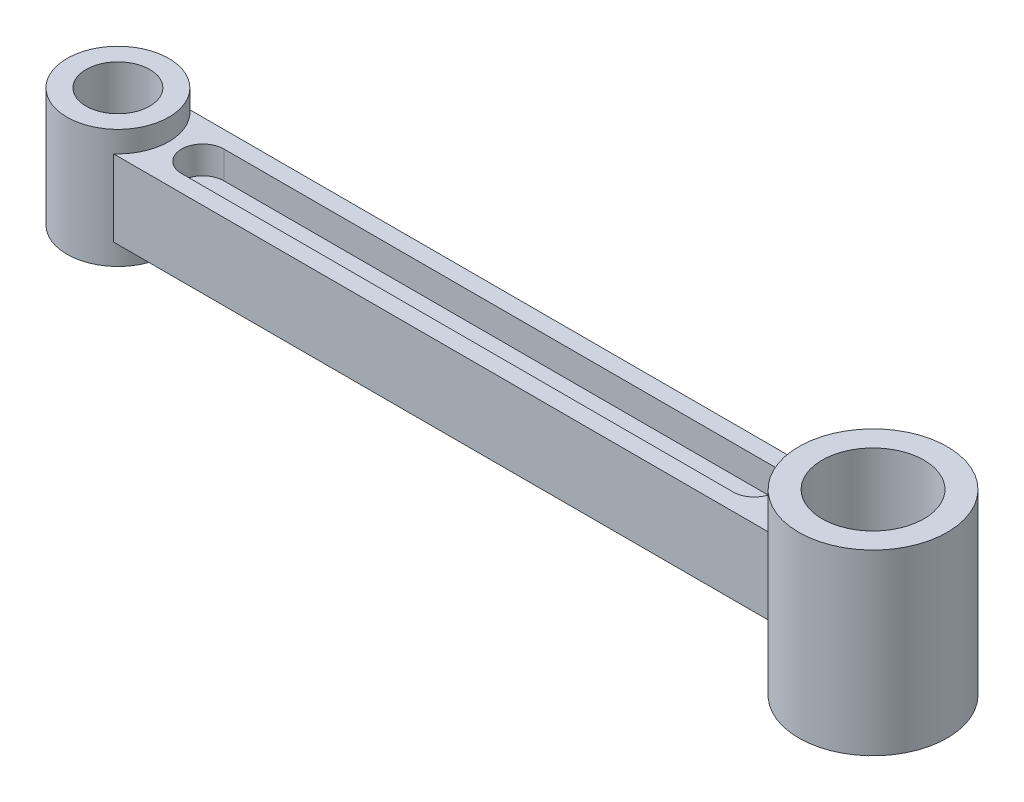
ISO-10303-21;
HEADER;
FILE_DESCRIPTION(('STEP AP214'),'2;1');
FILE_NAME('part.step','',(''),(''),'','','');
FILE_SCHEMA(('AUTOMOTIVE_DESIGN { 1 0 10303 214 1 1 1 1 }'));
ENDSEC;
DATA;
#1=APPLICATION_CONTEXT('core data for automotive mechanical design processes');
#2=APPLICATION_PROTOCOL_DEFINITION('international standard','automotive_design',2000,#1);
#3=PRODUCT_CONTEXT('',#1,'mechanical');
#4=PRODUCT('Part','Part','',(#3));
#5=PRODUCT_RELATED_PRODUCT_CATEGORY('part','',(#4));
#6=PRODUCT_DEFINITION_FORMATION('','',#4);
#7=PRODUCT_DEFINITION_CONTEXT('part definition',#1,'design');
#8=PRODUCT_DEFINITION('design','',#6,#7);
#9=PRODUCT_DEFINITION_SHAPE('','',#8);
#10=(LENGTH_UNIT() NAMED_UNIT(*) SI_UNIT(.MILLI.,.METRE.));
#11=(NAMED_UNIT(*) PLANE_ANGLE_UNIT() SI_UNIT($,.RADIAN.));
#12=(NAMED_UNIT(*) SI_UNIT($,.STERADIAN.) SOLID_ANGLE_UNIT());
#13=UNCERTAINTY_MEASURE_WITH_UNIT(LENGTH_MEASURE(1.E-05),#10,'distance_accuracy_value','');
#14=(GEOMETRIC_REPRESENTATION_CONTEXT(3) GLOBAL_UNCERTAINTY_ASSIGNED_CONTEXT((#13)) GLOBAL_UNIT_ASSIGNED_CONTEXT((#10,
#11,#12)) REPRESENTATION_CONTEXT('',''));
#15=CARTESIAN_POINT('',(0.,0.,0.));
#16=DIRECTION('',(0.,0.,1.));
#17=DIRECTION('',(1.,0.,0.));
#18=AXIS2_PLACEMENT_3D('',#15,#16,#17);
#19=CARTESIAN_POINT('',(0.,9.,4.99999999999999));
#20=DIRECTION('',(0.,0.,-1.));
#21=DIRECTION('',(-1.,0.,0.));
#22=AXIS2_PLACEMENT_3D('',#19,#20,#21);
#23=PLANE('',#22);
#24=DIRECTION('',(0.,-1.,0.));
#25=VECTOR('',#24,1.);
#26=CARTESIAN_POINT('',(20.,9.,4.99999999999999));
#27=LINE('',#26,#25);
#28=CARTESIAN_POINT('',(20.,-2.5,4.99999999999999));
#29=VERTEX_POINT('',#28);
#30=CARTESIAN_POINT('',(20.,-9.,4.99999999999999));
#31=VERTEX_POINT('',#30);
#32=EDGE_CURVE('E274',#29,#31,#27,.T.);
#33=ORIENTED_EDGE('',*,*,#32,.F.);
#34=DIRECTION('',(1.,0.,0.));
#35=VECTOR('',#34,1.);
#36=CARTESIAN_POINT('',(0.,-2.5,4.99999999999999));
#37=LINE('',#36,#35);
#38=CARTESIAN_POINT('',(150.,-2.5,5.00000000000002));
#39=VERTEX_POINT('',#38);
#40=EDGE_CURVE('E166',#29,#39,#37,.T.);
#41=ORIENTED_EDGE('',*,*,#40,.T.);
#42=DIRECTION('',(0.,-1.,0.));
#43=VECTOR('',#42,1.);
#44=CARTESIAN_POINT('',(150.,9.,5.00000000000002));
#45=LINE('',#44,#43);
#46=CARTESIAN_POINT('',(150.,-9.,5.00000000000002));
#47=VERTEX_POINT('',#46);
#48=EDGE_CURVE('E222',#39,#47,#45,.T.);
#49=ORIENTED_EDGE('',*,*,#48,.T.);
#50=DIRECTION('',(1.,0.,0.));
#51=VECTOR('',#50,1.);
#52=CARTESIAN_POINT('',(0.,-9.,4.99999999999999));
#53=LINE('',#52,#51);
#54=EDGE_CURVE('E187',#31,#47,#53,.T.);
#55=ORIENTED_EDGE('',*,*,#54,.F.);
#56=EDGE_LOOP('',(#33,#41,#49,#55));
#57=FACE_BOUND('',#56,.T.);
#58=ADVANCED_FACE('F40',(#57),#23,.T.);
#59=CARTESIAN_POINT('',(20.,9.,0.));
#60=DIRECTION('',(0.,-1.,0.));
#61=DIRECTION('',(0.,0.,-1.));
#62=AXIS2_PLACEMENT_3D('',#59,#60,#61);
#63=CYLINDRICAL_SURFACE('',#62,4.99999999999998);
#64=DIRECTION('',(0.,-1.,0.));
#65=VECTOR('',#64,1.);
#66=CARTESIAN_POINT('',(20.,9.,-4.99999999999999));
#67=LINE('',#66,#65);
#68=CARTESIAN_POINT('',(20.,-2.5,-4.99999999999999));
#69=VERTEX_POINT('',#68);
#70=CARTESIAN_POINT('',(20.,-9.,-4.99999999999999));
#71=VERTEX_POINT('',#70);
#72=EDGE_CURVE('E143',#69,#71,#67,.T.);
#73=ORIENTED_EDGE('',*,*,#72,.F.);
#74=CARTESIAN_POINT('',(20.,-2.5,0.));
#75=DIRECTION('',(0.,1.,0.));
#76=DIRECTION('',(0.,0.,1.));
#77=AXIS2_PLACEMENT_3D('',#74,#75,#76);
#78=CIRCLE('',#77,4.99999999999998);
#79=EDGE_CURVE('E162',#69,#29,#78,.T.);
#80=ORIENTED_EDGE('',*,*,#79,.T.);
#81=ORIENTED_EDGE('',*,*,#32,.T.);
#82=CARTESIAN_POINT('',(20.,-9.,0.));
#83=DIRECTION('',(0.,1.,0.));
#84=DIRECTION('',(0.,0.,1.));
#85=AXIS2_PLACEMENT_3D('',#82,#83,#84);
#86=CIRCLE('',#85,4.99999999999998);
#87=EDGE_CURVE('E226',#71,#31,#86,.T.);
#88=ORIENTED_EDGE('',*,*,#87,.F.);
#89=EDGE_LOOP('',(#73,#80,#81,#88));
#90=FACE_BOUND('',#89,.T.);
#91=ADVANCED_FACE('F305',(#90),#63,.F.);
#92=CARTESIAN_POINT('',(0.,9.,-4.99999999999999));
#93=DIRECTION('',(0.,0.,1.));
#94=DIRECTION('',(1.,0.,0.));
#95=AXIS2_PLACEMENT_3D('',#92,#93,#94);
#96=PLANE('',#95);
#97=DIRECTION('',(0.,-1.,0.));
#98=VECTOR('',#97,1.);
#99=CARTESIAN_POINT('',(150.,9.,-5.00000000000004));
#100=LINE('',#99,#98);
#101=CARTESIAN_POINT('',(150.,-2.5,-5.00000000000004));
#102=VERTEX_POINT('',#101);
#103=CARTESIAN_POINT('',(150.,-9.,-5.00000000000004));
#104=VERTEX_POINT('',#103);
#105=EDGE_CURVE('E144',#102,#104,#100,.T.);
#106=ORIENTED_EDGE('',*,*,#105,.F.);
#107=DIRECTION('',(-1.,0.,0.));
#108=VECTOR('',#107,1.);
#109=CARTESIAN_POINT('',(0.,-2.5,-4.99999999999999));
#110=LINE('',#109,#108);
#111=EDGE_CURVE('E174',#102,#69,#110,.T.);
#112=ORIENTED_EDGE('',*,*,#111,.T.);
#113=ORIENTED_EDGE('',*,*,#72,.T.);
#114=DIRECTION('',(-1.,0.,0.));
#115=VECTOR('',#114,1.);
#116=CARTESIAN_POINT('',(0.,-9.,-4.99999999999999));
#117=LINE('',#116,#115);
#118=EDGE_CURVE('E230',#104,#71,#117,.T.);
#119=ORIENTED_EDGE('',*,*,#118,.F.);
#120=EDGE_LOOP('',(#106,#112,#113,#119));
#121=FACE_BOUND('',#120,.T.);
#122=ADVANCED_FACE('F312',(#121),#96,.T.);
#123=CARTESIAN_POINT('',(150.,9.,0.));
#124=DIRECTION('',(0.,-1.,0.));
#125=DIRECTION('',(0.,0.,-1.));
#126=AXIS2_PLACEMENT_3D('',#123,#124,#125);
#127=CYLINDRICAL_SURFACE('',#126,5.);
#128=ORIENTED_EDGE('',*,*,#48,.F.);
#129=CARTESIAN_POINT('',(150.,-2.5,0.));
#130=DIRECTION('',(0.,1.,0.));
#131=DIRECTION('',(0.,0.,1.));
#132=AXIS2_PLACEMENT_3D('',#129,#130,#131);
#133=CIRCLE('',#132,5.);
#134=EDGE_CURVE('E170',#39,#102,#133,.T.);
#135=ORIENTED_EDGE('',*,*,#134,.T.);
#136=ORIENTED_EDGE('',*,*,#105,.T.);
#137=CARTESIAN_POINT('',(150.,-9.,0.));
#138=DIRECTION('',(0.,1.,0.));
#139=DIRECTION('',(0.,0.,1.));
#140=AXIS2_PLACEMENT_3D('',#137,#138,#139);
#141=CIRCLE('',#140,5.);
#142=EDGE_CURVE('E234',#47,#104,#141,.T.);
#143=ORIENTED_EDGE('',*,*,#142,.F.);
#144=EDGE_LOOP('',(#128,#135,#136,#143));
#145=FACE_BOUND('',#144,.T.);
#146=ADVANCED_FACE('F301',(#145),#127,.F.);
#147=CARTESIAN_POINT('',(0.,14.,0.));
#148=DIRECTION('',(0.,-1.,0.));
#149=DIRECTION('',(0.,0.,-1.));
#150=AXIS2_PLACEMENT_3D('',#147,#148,#149);
#151=CYLINDRICAL_SURFACE('',#150,12.);
#152=DIRECTION('',(0.,-1.,0.));
#153=VECTOR('',#152,1.);
#154=CARTESIAN_POINT('',(7.93725393319381,9.,9.00000000000001));
#155=LINE('',#154,#153);
#156=CARTESIAN_POINT('',(7.93725393319381,9.,9.00000000000001));
#157=VERTEX_POINT('',#156);
#158=CARTESIAN_POINT('',(7.93725393319381,-9.,9.00000000000001));
#159=VERTEX_POINT('',#158);
#160=EDGE_CURVE('E264',#157,#159,#155,.T.);
#161=ORIENTED_EDGE('',*,*,#160,.F.);
#162=CARTESIAN_POINT('',(0.,9.,0.));
#163=DIRECTION('',(0.,1.,0.));
#164=DIRECTION('',(0.,0.,1.));
#165=AXIS2_PLACEMENT_3D('',#162,#163,#164);
#166=CIRCLE('',#165,12.);
#167=CARTESIAN_POINT('',(7.93725393319381,9.,-9.00000000000002));
#168=VERTEX_POINT('',#167);
#169=EDGE_CURVE('E208',#157,#168,#166,.T.);
#170=ORIENTED_EDGE('',*,*,#169,.T.);
#171=DIRECTION('',(0.,-1.,0.));
#172=VECTOR('',#171,1.);
#173=CARTESIAN_POINT('',(7.93725393319381,9.,-9.00000000000002));
#174=LINE('',#173,#172);
#175=CARTESIAN_POINT('',(7.93725393319381,-9.,-9.00000000000002));
#176=VERTEX_POINT('',#175);
#177=EDGE_CURVE('E253',#168,#176,#174,.T.);
#178=ORIENTED_EDGE('',*,*,#177,.T.);
#179=CARTESIAN_POINT('',(0.,-9.,0.));
#180=DIRECTION('',(0.,1.,0.));
#181=DIRECTION('',(0.,0.,1.));
#182=AXIS2_PLACEMENT_3D('',#179,#180,#181);
#183=CIRCLE('',#182,12.);
#184=EDGE_CURVE('E238',#159,#176,#183,.T.);
#185=ORIENTED_EDGE('',*,*,#184,.F.);
#186=EDGE_LOOP('',(#161,#170,#178,#185));
#187=FACE_BOUND('',#186,.T.);
#188=CARTESIAN_POINT('',(0.,14.,0.));
#189=DIRECTION('',(0.,1.,0.));
#190=DIRECTION('',(0.,0.,1.));
#191=AXIS2_PLACEMENT_3D('',#188,#189,#190);
#192=CIRCLE('',#191,12.);
#193=CARTESIAN_POINT('',(0.,14.,12.));
#194=VERTEX_POINT('',#193);
#195=EDGE_CURVE('E50',#194,#194,#192,.T.);
#196=ORIENTED_EDGE('',*,*,#195,.F.);
#197=EDGE_LOOP('',(#196));
#198=FACE_BOUND('',#197,.T.);
#199=CARTESIAN_POINT('',(0.,-14.,0.));
#200=DIRECTION('',(0.,1.,0.));
#201=DIRECTION('',(0.,0.,1.));
#202=AXIS2_PLACEMENT_3D('',#199,#200,#201);
#203=CIRCLE('',#202,12.);
#204=CARTESIAN_POINT('',(0.,-14.,12.));
#205=VERTEX_POINT('',#204);
#206=EDGE_CURVE('E268',#205,#205,#203,.T.);
#207=ORIENTED_EDGE('',*,*,#206,.T.);
#208=EDGE_LOOP('',(#207));
#209=FACE_BOUND('',#208,.T.);
#210=ADVANCED_FACE('F42',(#187,#198,#209),#151,.T.);
#211=CARTESIAN_POINT('',(0.,14.,0.));
#212=DIRECTION('',(0.,-1.,0.));
#213=DIRECTION('',(0.,0.,-1.));
#214=AXIS2_PLACEMENT_3D('',#211,#212,#213);
#215=CYLINDRICAL_SURFACE('',#214,7.5);
#216=CARTESIAN_POINT('',(0.,14.,0.));
#217=DIRECTION('',(0.,1.,0.));
#218=DIRECTION('',(0.,0.,1.));
#219=AXIS2_PLACEMENT_3D('',#216,#217,#218);
#220=CIRCLE('',#219,7.5);
#221=CARTESIAN_POINT('',(0.,14.,7.50000000000001));
#222=VERTEX_POINT('',#221);
#223=EDGE_CURVE('E11',#222,#222,#220,.T.);
#224=ORIENTED_EDGE('',*,*,#223,.T.);
#225=EDGE_LOOP('',(#224));
#226=FACE_BOUND('',#225,.T.);
#227=CARTESIAN_POINT('',(0.,-14.,0.));
#228=DIRECTION('',(0.,1.,0.));
#229=DIRECTION('',(0.,0.,1.));
#230=AXIS2_PLACEMENT_3D('',#227,#228,#229);
#231=CIRCLE('',#230,7.5);
#232=CARTESIAN_POINT('',(0.,-14.,7.50000000000001));
#233=VERTEX_POINT('',#232);
#234=EDGE_CURVE('E44',#233,#233,#231,.T.);
#235=ORIENTED_EDGE('',*,*,#234,.F.);
#236=EDGE_LOOP('',(#235));
#237=FACE_BOUND('',#236,.T.);
#238=ADVANCED_FACE('F291',(#226,#237),#215,.F.);
#239=CARTESIAN_POINT('',(0.,14.,0.));
#240=DIRECTION('',(0.,1.,0.));
#241=DIRECTION('',(0.,0.,1.));
#242=AXIS2_PLACEMENT_3D('',#239,#240,#241);
#243=PLANE('',#242);
#244=ORIENTED_EDGE('',*,*,#195,.T.);
#245=EDGE_LOOP('',(#244));
#246=FACE_BOUND('',#245,.T.);
#247=ORIENTED_EDGE('',*,*,#223,.F.);
#248=EDGE_LOOP('',(#247));
#249=FACE_BOUND('',#248,.T.);
#250=ADVANCED_FACE('F293',(#246,#249),#243,.T.);
#251=CARTESIAN_POINT('',(0.,-14.,0.));
#252=DIRECTION('',(0.,1.,0.));
#253=DIRECTION('',(0.,0.,1.));
#254=AXIS2_PLACEMENT_3D('',#251,#252,#253);
#255=PLANE('',#254);
#256=ORIENTED_EDGE('',*,*,#206,.F.);
#257=EDGE_LOOP('',(#256));
#258=FACE_BOUND('',#257,.T.);
#259=ORIENTED_EDGE('',*,*,#234,.T.);
#260=EDGE_LOOP('',(#259));
#261=FACE_BOUND('',#260,.T.);
#262=ADVANCED_FACE('F289',(#258,#261),#255,.F.);
#263=CARTESIAN_POINT('',(0.,9.,9.00000000000001));
#264=DIRECTION('',(0.,0.,-1.));
#265=DIRECTION('',(-1.,0.,0.));
#266=AXIS2_PLACEMENT_3D('',#263,#264,#265);
#267=PLANE('',#266);
#268=DIRECTION('',(1.,0.,0.));
#269=VECTOR('',#268,1.);
#270=CARTESIAN_POINT('',(0.,-9.,9.00000000000001));
#271=LINE('',#270,#269);
#272=CARTESIAN_POINT('',(162.991668980197,-9.,8.99999999999998));
#273=VERTEX_POINT('',#272);
#274=EDGE_CURVE('E242',#159,#273,#271,.T.);
#275=ORIENTED_EDGE('',*,*,#274,.T.);
#276=DIRECTION('',(0.,-1.,0.));
#277=VECTOR('',#276,1.);
#278=CARTESIAN_POINT('',(162.991668980197,9.,8.99999999999998));
#279=LINE('',#278,#277);
#280=CARTESIAN_POINT('',(162.991668980197,9.,9.00000000000005));
#281=VERTEX_POINT('',#280);
#282=EDGE_CURVE('E261',#281,#273,#279,.T.);
#283=ORIENTED_EDGE('',*,*,#282,.F.);
#284=DIRECTION('',(1.,0.,0.));
#285=VECTOR('',#284,1.);
#286=CARTESIAN_POINT('',(0.,9.,9.00000000000001));
#287=LINE('',#286,#285);
#288=EDGE_CURVE('E211',#157,#281,#287,.T.);
#289=ORIENTED_EDGE('',*,*,#288,.F.);
#290=ORIENTED_EDGE('',*,*,#160,.T.);
#291=EDGE_LOOP('',(#275,#283,#289,#290));
#292=FACE_BOUND('',#291,.T.);
#293=ADVANCED_FACE('F318',(#292),#267,.F.);
#294=DIRECTION('',(1.,0.,0.));
#295=VECTOR('',#294,1.);
#296=CARTESIAN_POINT('',(0.,2.5,4.99999999999999));
#297=LINE('',#296,#295);
#298=CARTESIAN_POINT('',(20.,2.5,4.99999999999999));
#299=VERTEX_POINT('',#298);
#300=CARTESIAN_POINT('',(150.,2.5,5.00000000000002));
#301=VERTEX_POINT('',#300);
#302=EDGE_CURVE('E58',#299,#301,#297,.T.);
#303=ORIENTED_EDGE('',*,*,#302,.F.);
#304=CARTESIAN_POINT('',(20.,9.,4.99999999999999));
#305=VERTEX_POINT('',#304);
#306=EDGE_CURVE('E257',#305,#299,#27,.T.);
#307=ORIENTED_EDGE('',*,*,#306,.F.);
#308=DIRECTION('',(1.,0.,0.));
#309=VECTOR('',#308,1.);
#310=CARTESIAN_POINT('',(0.,9.,4.99999999999999));
#311=LINE('',#310,#309);
#312=CARTESIAN_POINT('',(150.,9.,5.00000000000002));
#313=VERTEX_POINT('',#312);
#314=EDGE_CURVE('E194',#305,#313,#311,.T.);
#315=ORIENTED_EDGE('',*,*,#314,.T.);
#316=EDGE_CURVE('E269',#313,#301,#45,.T.);
#317=ORIENTED_EDGE('',*,*,#316,.T.);
#318=EDGE_LOOP('',(#303,#307,#315,#317));
#319=FACE_BOUND('',#318,.T.);
#320=ADVANCED_FACE('F308',(#319),#23,.T.);
#321=CARTESIAN_POINT('',(20.,2.5,0.));
#322=DIRECTION('',(0.,1.,0.));
#323=DIRECTION('',(0.,0.,1.));
#324=AXIS2_PLACEMENT_3D('',#321,#322,#323);
#325=CIRCLE('',#324,4.99999999999998);
#326=CARTESIAN_POINT('',(20.,2.5,-4.99999999999999));
#327=VERTEX_POINT('',#326);
#328=EDGE_CURVE('E65',#327,#299,#325,.T.);
#329=ORIENTED_EDGE('',*,*,#328,.F.);
#330=CARTESIAN_POINT('',(20.,9.,-4.99999999999999));
#331=VERTEX_POINT('',#330);
#332=EDGE_CURVE('E149',#331,#327,#67,.T.);
#333=ORIENTED_EDGE('',*,*,#332,.F.);
#334=CARTESIAN_POINT('',(20.,9.,0.));
#335=DIRECTION('',(0.,1.,0.));
#336=DIRECTION('',(0.,0.,1.));
#337=AXIS2_PLACEMENT_3D('',#334,#335,#336);
#338=CIRCLE('',#337,4.99999999999998);
#339=EDGE_CURVE('E198',#331,#305,#338,.T.);
#340=ORIENTED_EDGE('',*,*,#339,.T.);
#341=ORIENTED_EDGE('',*,*,#306,.T.);
#342=EDGE_LOOP('',(#329,#333,#340,#341));
#343=FACE_BOUND('',#342,.T.);
#344=ADVANCED_FACE('F315',(#343),#63,.F.);
#345=DIRECTION('',(-1.,0.,0.));
#346=VECTOR('',#345,1.);
#347=CARTESIAN_POINT('',(0.,2.5,-4.99999999999999));
#348=LINE('',#347,#346);
#349=CARTESIAN_POINT('',(150.,2.5,-5.00000000000004));
#350=VERTEX_POINT('',#349);
#351=EDGE_CURVE('E147',#350,#327,#348,.T.);
#352=ORIENTED_EDGE('',*,*,#351,.F.);
#353=CARTESIAN_POINT('',(150.,9.,-5.00000000000004));
#354=VERTEX_POINT('',#353);
#355=EDGE_CURVE('E132',#354,#350,#100,.T.);
#356=ORIENTED_EDGE('',*,*,#355,.F.);
#357=DIRECTION('',(-1.,0.,0.));
#358=VECTOR('',#357,1.);
#359=CARTESIAN_POINT('',(0.,9.,-4.99999999999999));
#360=LINE('',#359,#358);
#361=EDGE_CURVE('E203',#354,#331,#360,.T.);
#362=ORIENTED_EDGE('',*,*,#361,.T.);
#363=ORIENTED_EDGE('',*,*,#332,.T.);
#364=EDGE_LOOP('',(#352,#356,#362,#363));
#365=FACE_BOUND('',#364,.T.);
#366=ADVANCED_FACE('F148',(#365),#96,.T.);
#367=CARTESIAN_POINT('',(150.,2.5,0.));
#368=DIRECTION('',(0.,1.,0.));
#369=DIRECTION('',(0.,0.,1.));
#370=AXIS2_PLACEMENT_3D('',#367,#368,#369);
#371=CIRCLE('',#370,5.);
#372=EDGE_CURVE('E136',#301,#350,#371,.T.);
#373=ORIENTED_EDGE('',*,*,#372,.F.);
#374=ORIENTED_EDGE('',*,*,#316,.F.);
#375=CARTESIAN_POINT('',(150.,9.,0.));
#376=DIRECTION('',(0.,1.,0.));
#377=DIRECTION('',(0.,0.,1.));
#378=AXIS2_PLACEMENT_3D('',#375,#376,#377);
#379=CIRCLE('',#378,5.);
#380=EDGE_CURVE('E138',#313,#354,#379,.T.);
#381=ORIENTED_EDGE('',*,*,#380,.T.);
#382=ORIENTED_EDGE('',*,*,#355,.T.);
#383=EDGE_LOOP('',(#373,#374,#381,#382));
#384=FACE_BOUND('',#383,.T.);
#385=ADVANCED_FACE('F134',(#384),#127,.F.);
#386=CARTESIAN_POINT('',(0.,9.,-9.00000000000001));
#387=DIRECTION('',(0.,0.,-1.));
#388=DIRECTION('',(-1.,0.,0.));
#389=AXIS2_PLACEMENT_3D('',#386,#387,#388);
#390=PLANE('',#389);
#391=DIRECTION('',(1.,0.,0.));
#392=VECTOR('',#391,1.);
#393=CARTESIAN_POINT('',(0.,-9.,-9.00000000000001));
#394=LINE('',#393,#392);
#395=CARTESIAN_POINT('',(162.991668980197,-9.,-9.00000000000002));
#396=VERTEX_POINT('',#395);
#397=EDGE_CURVE('E199',#176,#396,#394,.T.);
#398=ORIENTED_EDGE('',*,*,#397,.F.);
#399=ORIENTED_EDGE('',*,*,#177,.F.);
#400=DIRECTION('',(1.,0.,0.));
#401=VECTOR('',#400,1.);
#402=CARTESIAN_POINT('',(0.,9.,-9.00000000000001));
#403=LINE('',#402,#401);
#404=CARTESIAN_POINT('',(162.991668980197,9.,-9.00000000000002));
#405=VERTEX_POINT('',#404);
#406=EDGE_CURVE('E218',#168,#405,#403,.T.);
#407=ORIENTED_EDGE('',*,*,#406,.T.);
#408=DIRECTION('',(0.,-1.,0.));
#409=VECTOR('',#408,1.);
#410=CARTESIAN_POINT('',(162.991668980197,9.,-9.00000000000002));
#411=LINE('',#410,#409);
#412=EDGE_CURVE('E256',#405,#396,#411,.T.);
#413=ORIENTED_EDGE('',*,*,#412,.T.);
#414=EDGE_LOOP('',(#398,#399,#407,#413));
#415=FACE_BOUND('',#414,.T.);
#416=ADVANCED_FACE('F331',(#415),#390,.T.);
#417=CARTESIAN_POINT('',(0.,9.,0.));
#418=DIRECTION('',(0.,1.,0.));
#419=DIRECTION('',(0.,0.,1.));
#420=AXIS2_PLACEMENT_3D('',#417,#418,#419);
#421=PLANE('',#420);
#422=ORIENTED_EDGE('',*,*,#314,.F.);
#423=ORIENTED_EDGE('',*,*,#339,.F.);
#424=ORIENTED_EDGE('',*,*,#361,.F.);
#425=ORIENTED_EDGE('',*,*,#380,.F.);
#426=EDGE_LOOP('',(#422,#423,#424,#425));
#427=FACE_BOUND('',#426,.T.);
#428=ORIENTED_EDGE('',*,*,#169,.F.);
#429=ORIENTED_EDGE('',*,*,#288,.T.);
#430=CARTESIAN_POINT('',(178.,9.,0.));
#431=DIRECTION('',(0.,1.,0.));
#432=DIRECTION('',(0.,0.,1.));
#433=AXIS2_PLACEMENT_3D('',#430,#431,#432);
#434=CIRCLE('',#433,17.5);
#435=EDGE_CURVE('E215',#405,#281,#434,.T.);
#436=ORIENTED_EDGE('',*,*,#435,.F.);
#437=ORIENTED_EDGE('',*,*,#406,.F.);
#438=EDGE_LOOP('',(#428,#429,#436,#437));
#439=FACE_BOUND('',#438,.T.);
#440=ADVANCED_FACE('F416',(#427,#439),#421,.T.);
#441=CARTESIAN_POINT('',(0.,-9.,0.));
#442=DIRECTION('',(0.,1.,0.));
#443=DIRECTION('',(0.,0.,1.));
#444=AXIS2_PLACEMENT_3D('',#441,#442,#443);
#445=PLANE('',#444);
#446=ORIENTED_EDGE('',*,*,#54,.T.);
#447=ORIENTED_EDGE('',*,*,#142,.T.);
#448=ORIENTED_EDGE('',*,*,#118,.T.);
#449=ORIENTED_EDGE('',*,*,#87,.T.);
#450=EDGE_LOOP('',(#446,#447,#448,#449));
#451=FACE_BOUND('',#450,.T.);
#452=ORIENTED_EDGE('',*,*,#184,.T.);
#453=ORIENTED_EDGE('',*,*,#397,.T.);
#454=CARTESIAN_POINT('',(178.,-9.,0.));
#455=DIRECTION('',(0.,1.,0.));
#456=DIRECTION('',(0.,0.,1.));
#457=AXIS2_PLACEMENT_3D('',#454,#455,#456);
#458=CIRCLE('',#457,17.5);
#459=EDGE_CURVE('E246',#396,#273,#458,.T.);
#460=ORIENTED_EDGE('',*,*,#459,.T.);
#461=ORIENTED_EDGE('',*,*,#274,.F.);
#462=EDGE_LOOP('',(#452,#453,#460,#461));
#463=FACE_BOUND('',#462,.T.);
#464=ADVANCED_FACE('F379',(#451,#463),#445,.F.);
#465=CARTESIAN_POINT('',(178.,21.,0.));
#466=DIRECTION('',(0.,-1.,0.));
#467=DIRECTION('',(0.,0.,-1.));
#468=AXIS2_PLACEMENT_3D('',#465,#466,#467);
#469=CYLINDRICAL_SURFACE('',#468,12.);
#470=CARTESIAN_POINT('',(178.,21.,0.));
#471=DIRECTION('',(0.,1.,0.));
#472=DIRECTION('',(0.,0.,1.));
#473=AXIS2_PLACEMENT_3D('',#470,#471,#472);
#474=CIRCLE('',#473,12.);
#475=CARTESIAN_POINT('',(178.,21.,-12.));
#476=VERTEX_POINT('',#475);
#477=EDGE_CURVE('E178',#476,#476,#474,.T.);
#478=CARTESIAN_POINT('',(178.,-21.,0.));
#479=DIRECTION('',(0.,1.,0.));
#480=DIRECTION('',(0.,0.,1.));
#481=AXIS2_PLACEMENT_3D('',#478,#479,#480);
#482=CIRCLE('',#481,12.);
#483=CARTESIAN_POINT('',(178.,-21.,-12.));
#484=VERTEX_POINT('',#483);
#485=EDGE_CURVE('E152',#484,#484,#482,.T.);
#486=CARTESIAN_POINT('',(178.,21.,-12.));
#487=CARTESIAN_POINT('',(178.,20.5625,-12.));
#488=CARTESIAN_POINT('',(178.,20.125,-12.));
#489=CARTESIAN_POINT('',(178.,19.25,-12.));
#490=CARTESIAN_POINT('',(178.,18.8125,-12.));
#491=CARTESIAN_POINT('',(178.,17.9375,-12.));
#492=CARTESIAN_POINT('',(178.,17.5,-12.));
#493=CARTESIAN_POINT('',(178.,16.625,-12.));
#494=CARTESIAN_POINT('',(178.,16.1875,-12.));
#495=CARTESIAN_POINT('',(178.,15.3125,-12.));
#496=CARTESIAN_POINT('',(178.,14.875,-12.));
#497=CARTESIAN_POINT('',(178.,14.,-12.));
#498=CARTESIAN_POINT('',(178.,13.5625,-12.));
#499=CARTESIAN_POINT('',(178.,12.6875,-12.));
#500=CARTESIAN_POINT('',(178.,12.25,-12.));
#501=CARTESIAN_POINT('',(178.,11.375,-12.));
#502=CARTESIAN_POINT('',(178.,10.9375,-12.));
#503=CARTESIAN_POINT('',(178.,10.0625,-12.));
#504=CARTESIAN_POINT('',(178.,9.625,-12.));
#505=CARTESIAN_POINT('',(178.,8.75,-12.));
#506=CARTESIAN_POINT('',(178.,8.3125,-12.));
#507=CARTESIAN_POINT('',(178.,7.4375,-12.));
#508=CARTESIAN_POINT('',(178.,7.,-12.));
#509=CARTESIAN_POINT('',(178.,6.125,-12.));
#510=CARTESIAN_POINT('',(178.,5.6875,-12.));
#511=CARTESIAN_POINT('',(178.,4.8125,-12.));
#512=CARTESIAN_POINT('',(178.,4.375,-12.));
#513=CARTESIAN_POINT('',(178.,3.5,-12.));
#514=CARTESIAN_POINT('',(178.,3.0625,-12.));
#515=CARTESIAN_POINT('',(178.,2.1875,-12.));
#516=CARTESIAN_POINT('',(178.,1.75,-12.));
#517=CARTESIAN_POINT('',(178.,0.875000000000001,-12.));
#518=CARTESIAN_POINT('',(178.,0.4375,-12.));
#519=CARTESIAN_POINT('',(178.,-0.4375,-12.));
#520=CARTESIAN_POINT('',(178.,-0.875000000000001,-12.));
#521=CARTESIAN_POINT('',(178.,-1.75,-12.));
#522=CARTESIAN_POINT('',(178.,-2.1875,-12.));
#523=CARTESIAN_POINT('',(178.,-3.0625,-12.));
#524=CARTESIAN_POINT('',(178.,-3.5,-12.));
#525=CARTESIAN_POINT('',(178.,-4.375,-12.));
#526=CARTESIAN_POINT('',(178.,-4.8125,-12.));
#527=CARTESIAN_POINT('',(178.,-5.6875,-12.));
#528=CARTESIAN_POINT('',(178.,-6.125,-12.));
#529=CARTESIAN_POINT('',(178.,-7.,-12.));
#530=CARTESIAN_POINT('',(178.,-7.4375,-12.));
#531=CARTESIAN_POINT('',(178.,-8.3125,-12.));
#532=CARTESIAN_POINT('',(178.,-8.75,-12.));
#533=CARTESIAN_POINT('',(178.,-9.625,-12.));
#534=CARTESIAN_POINT('',(178.,-10.0625,-12.));
#535=CARTESIAN_POINT('',(178.,-10.9375,-12.));
#536=CARTESIAN_POINT('',(178.,-11.375,-12.));
#537=CARTESIAN_POINT('',(178.,-12.25,-12.));
#538=CARTESIAN_POINT('',(178.,-12.6875,-12.));
#539=CARTESIAN_POINT('',(178.,-13.5625,-12.));
#540=CARTESIAN_POINT('',(178.,-14.,-12.));
#541=CARTESIAN_POINT('',(178.,-14.875,-12.));
#542=CARTESIAN_POINT('',(178.,-15.3125,-12.));
#543=CARTESIAN_POINT('',(178.,-16.1875,-12.));
#544=CARTESIAN_POINT('',(178.,-16.625,-12.));
#545=CARTESIAN_POINT('',(178.,-17.5,-12.));
#546=CARTESIAN_POINT('',(178.,-17.9375,-12.));
#547=CARTESIAN_POINT('',(178.,-18.8125,-12.));
#548=CARTESIAN_POINT('',(178.,-19.25,-12.));
#549=CARTESIAN_POINT('',(178.,-20.125,-12.));
#550=CARTESIAN_POINT('',(178.,-20.5625,-12.));
#551=CARTESIAN_POINT('',(178.,-21.,-12.));
#552=B_SPLINE_CURVE_WITH_KNOTS('',3,(#486,#487,#488,#489,#490,#491,#492,#493,#494,#495,#496,
#497,#498,#499,#500,#501,#502,#503,#504,#505,#506,#507,#508,#509,#510,#511,#512,#513,#514,#515,
#516,#517,#518,#519,#520,#521,#522,#523,#524,#525,#526,#527,#528,#529,#530,#531,#532,#533,#534,
#535,#536,#537,#538,#539,#540,#541,#542,#543,#544,#545,#546,#547,#548,#549,#550,#551),
.UNSPECIFIED.,.F.,.F.,(4,2,2,2,2,2,2,2,2,2,2,2,2,2,2,2,2,2,2,2,2,2,2,2,2,2,2,2,2,2,2,2,4),(0.,
1.3125,2.625,3.9375,5.25,6.5625,7.875,9.1875,10.5,11.8125,13.125,14.4375,15.75,17.0625,18.375,
19.6875,21.,22.3125,23.625,24.9375,26.25,27.5625,28.875,30.1875,31.5,32.8125,34.125,35.4375,
36.75,38.0625,39.375,40.6875,42.),.UNSPECIFIED.);
#553=EDGE_CURVE('BSEAM411',#476,#484,#552,.T.);
#554=ORIENTED_EDGE('',*,*,#477,.T.);
#555=ORIENTED_EDGE('',*,*,#485,.F.);
#556=ORIENTED_EDGE('',*,*,#553,.T.);
#557=ORIENTED_EDGE('',*,*,#553,.F.);
#558=EDGE_LOOP('',(#554,#556,#555,#557));
#559=FACE_BOUND('',#558,.T.);
#560=ADVANCED_FACE('F411',(#559),#469,.F.);
#561=CARTESIAN_POINT('',(178.,21.,0.));
#562=DIRECTION('',(0.,-1.,0.));
#563=DIRECTION('',(0.,0.,-1.));
#564=AXIS2_PLACEMENT_3D('',#561,#562,#563);
#565=CYLINDRICAL_SURFACE('',#564,17.5);
#566=ORIENTED_EDGE('',*,*,#435,.T.);
#567=ORIENTED_EDGE('',*,*,#282,.T.);
#568=ORIENTED_EDGE('',*,*,#459,.F.);
#569=ORIENTED_EDGE('',*,*,#412,.F.);
#570=EDGE_LOOP('',(#566,#567,#568,#569));
#571=FACE_BOUND('',#570,.T.);
#572=CARTESIAN_POINT('',(178.,21.,0.));
#573=DIRECTION('',(0.,1.,0.));
#574=DIRECTION('',(0.,0.,1.));
#575=AXIS2_PLACEMENT_3D('',#572,#573,#574);
#576=CIRCLE('',#575,17.5);
#577=CARTESIAN_POINT('',(178.,21.,17.5000000000001));
#578=VERTEX_POINT('',#577);
#579=EDGE_CURVE('E182',#578,#578,#576,.T.);
#580=ORIENTED_EDGE('',*,*,#579,.F.);
#581=EDGE_LOOP('',(#580));
#582=FACE_BOUND('',#581,.T.);
#583=CARTESIAN_POINT('',(178.,-21.,0.));
#584=DIRECTION('',(0.,1.,0.));
#585=DIRECTION('',(0.,0.,1.));
#586=AXIS2_PLACEMENT_3D('',#583,#584,#585);
#587=CIRCLE('',#586,17.5);
#588=CARTESIAN_POINT('',(178.,-21.,17.5000000000001));
#589=VERTEX_POINT('',#588);
#590=EDGE_CURVE('E183',#589,#589,#587,.T.);
#591=ORIENTED_EDGE('',*,*,#590,.T.);
#592=EDGE_LOOP('',(#591));
#593=FACE_BOUND('',#592,.T.);
#594=ADVANCED_FACE('F406',(#571,#582,#593),#565,.T.);
#595=CARTESIAN_POINT('',(0.,21.,0.));
#596=DIRECTION('',(0.,1.,0.));
#597=DIRECTION('',(0.,0.,1.));
#598=AXIS2_PLACEMENT_3D('',#595,#596,#597);
#599=PLANE('',#598);
#600=ORIENTED_EDGE('',*,*,#477,.F.);
#601=EDGE_LOOP('',(#600));
#602=FACE_BOUND('',#601,.T.);
#603=ORIENTED_EDGE('',*,*,#579,.T.);
#604=EDGE_LOOP('',(#603));
#605=FACE_BOUND('',#604,.T.);
#606=ADVANCED_FACE('F401',(#602,#605),#599,.T.);
#607=CARTESIAN_POINT('',(0.,-21.,0.));
#608=DIRECTION('',(0.,1.,0.));
#609=DIRECTION('',(0.,0.,1.));
#610=AXIS2_PLACEMENT_3D('',#607,#608,#609);
#611=PLANE('',#610);
#612=ORIENTED_EDGE('',*,*,#485,.T.);
#613=EDGE_LOOP('',(#612));
#614=FACE_BOUND('',#613,.T.);
#615=ORIENTED_EDGE('',*,*,#590,.F.);
#616=EDGE_LOOP('',(#615));
#617=FACE_BOUND('',#616,.T.);
#618=ADVANCED_FACE('F394',(#614,#617),#611,.F.);
#619=CARTESIAN_POINT('',(0.,-2.5,0.));
#620=DIRECTION('',(0.,1.,0.));
#621=DIRECTION('',(0.,0.,1.));
#622=AXIS2_PLACEMENT_3D('',#619,#620,#621);
#623=PLANE('',#622);
#624=ORIENTED_EDGE('',*,*,#79,.F.);
#625=ORIENTED_EDGE('',*,*,#111,.F.);
#626=ORIENTED_EDGE('',*,*,#134,.F.);
#627=ORIENTED_EDGE('',*,*,#40,.F.);
#628=EDGE_LOOP('',(#624,#625,#626,#627));
#629=FACE_BOUND('',#628,.T.);
#630=ADVANCED_FACE('F392',(#629),#623,.F.);
#631=CARTESIAN_POINT('',(0.,2.5,0.));
#632=DIRECTION('',(0.,1.,0.));
#633=DIRECTION('',(0.,0.,1.));
#634=AXIS2_PLACEMENT_3D('',#631,#632,#633);
#635=PLANE('',#634);
#636=ORIENTED_EDGE('',*,*,#328,.T.);
#637=ORIENTED_EDGE('',*,*,#302,.T.);
#638=ORIENTED_EDGE('',*,*,#372,.T.);
#639=ORIENTED_EDGE('',*,*,#351,.T.);
#640=EDGE_LOOP('',(#636,#637,#638,#639));
#641=FACE_BOUND('',#640,.T.);
#642=ADVANCED_FACE('F154',(#641),#635,.T.);
#643=CLOSED_SHELL('',(#58,#91,#122,#146,#210,#238,#250,#262,#293,#320,#344,#366,#385,#416,#440,
#464,#560,#594,#606,#618,#630,#642));
#644=MANIFOLD_SOLID_BREP('B2',#643);
#645=ADVANCED_BREP_SHAPE_REPRESENTATION('',(#18,#644),#14);
#646=SHAPE_DEFINITION_REPRESENTATION(#9,#645);
ENDSEC;
END-ISO-10303-21;
